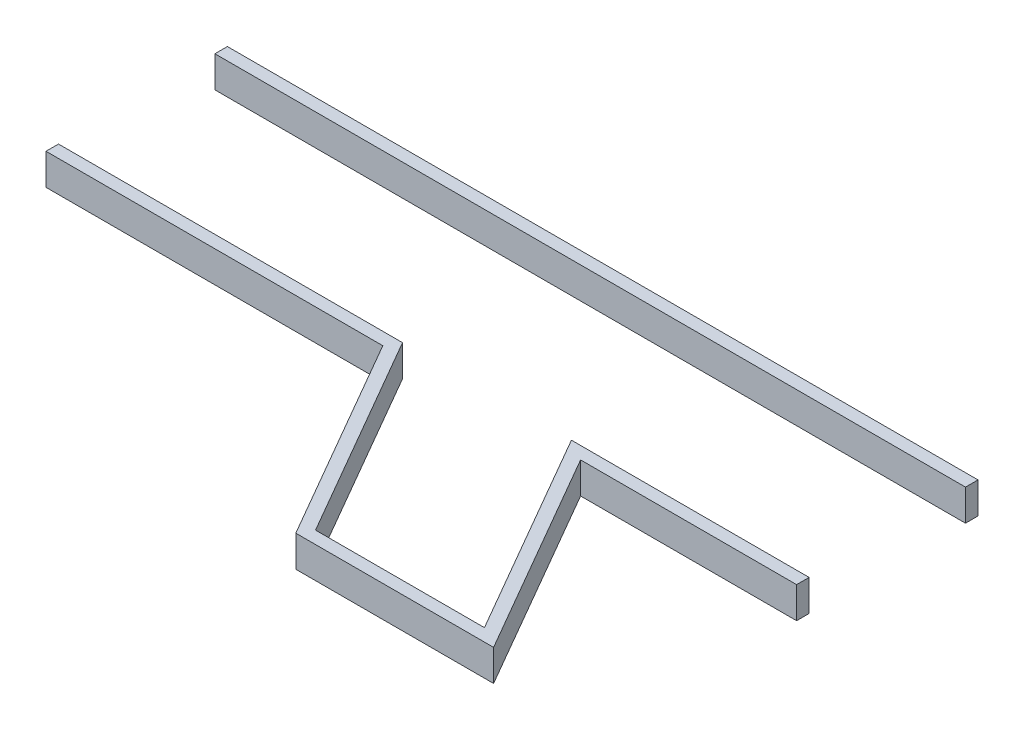
ISO-10303-21;
HEADER;
FILE_DESCRIPTION(('STEP AP214'),'2;1');
FILE_NAME('part.step','',(''),(''),'','','');
FILE_SCHEMA(('AUTOMOTIVE_DESIGN { 1 0 10303 214 1 1 1 1 }'));
ENDSEC;
DATA;
#1=APPLICATION_CONTEXT('core data for automotive mechanical design processes');
#2=APPLICATION_PROTOCOL_DEFINITION('international standard','automotive_design',2000,#1);
#3=PRODUCT_CONTEXT('',#1,'mechanical');
#4=PRODUCT('Part','Part','',(#3));
#5=PRODUCT_RELATED_PRODUCT_CATEGORY('part','',(#4));
#6=PRODUCT_DEFINITION_FORMATION('','',#4);
#7=PRODUCT_DEFINITION_CONTEXT('part definition',#1,'design');
#8=PRODUCT_DEFINITION('design','',#6,#7);
#9=PRODUCT_DEFINITION_SHAPE('','',#8);
#10=(LENGTH_UNIT() NAMED_UNIT(*) SI_UNIT(.MILLI.,.METRE.));
#11=(NAMED_UNIT(*) PLANE_ANGLE_UNIT() SI_UNIT($,.RADIAN.));
#12=(NAMED_UNIT(*) SI_UNIT($,.STERADIAN.) SOLID_ANGLE_UNIT());
#13=UNCERTAINTY_MEASURE_WITH_UNIT(LENGTH_MEASURE(1.E-05),#10,'distance_accuracy_value','');
#14=(GEOMETRIC_REPRESENTATION_CONTEXT(3) GLOBAL_UNCERTAINTY_ASSIGNED_CONTEXT((#13)) GLOBAL_UNIT_ASSIGNED_CONTEXT((#10,
#11,#12)) REPRESENTATION_CONTEXT('',''));
#15=CARTESIAN_POINT('',(0.,0.,0.));
#16=DIRECTION('',(0.,0.,1.));
#17=DIRECTION('',(1.,0.,0.));
#18=AXIS2_PLACEMENT_3D('',#15,#16,#17);
#19=CARTESIAN_POINT('',(-600.,50.,-145.));
#20=DIRECTION('',(1.,0.,0.));
#21=DIRECTION('',(0.,0.,-1.));
#22=AXIS2_PLACEMENT_3D('',#19,#20,#21);
#23=PLANE('',#22);
#24=DIRECTION('',(0.,0.,1.));
#25=VECTOR('',#24,1.);
#26=CARTESIAN_POINT('',(-600.,0.,-145.));
#27=LINE('',#26,#25);
#28=CARTESIAN_POINT('',(-600.,0.,-145.));
#29=VERTEX_POINT('',#28);
#30=CARTESIAN_POINT('',(-600.,0.,-125.));
#31=VERTEX_POINT('',#30);
#32=EDGE_CURVE('E12',#29,#31,#27,.T.);
#33=ORIENTED_EDGE('',*,*,#32,.T.);
#34=DIRECTION('',(0.,-1.,0.));
#35=VECTOR('',#34,1.);
#36=CARTESIAN_POINT('',(-600.,50.,-125.));
#37=LINE('',#36,#35);
#38=CARTESIAN_POINT('',(-600.,50.,-125.));
#39=VERTEX_POINT('',#38);
#40=EDGE_CURVE('E120',#39,#31,#37,.T.);
#41=ORIENTED_EDGE('',*,*,#40,.F.);
#42=DIRECTION('',(0.,0.,1.));
#43=VECTOR('',#42,1.);
#44=CARTESIAN_POINT('',(-600.,50.,-145.));
#45=LINE('',#44,#43);
#46=CARTESIAN_POINT('',(-600.,50.,-145.));
#47=VERTEX_POINT('',#46);
#48=EDGE_CURVE('E53',#47,#39,#45,.T.);
#49=ORIENTED_EDGE('',*,*,#48,.F.);
#50=DIRECTION('',(0.,-1.,0.));
#51=VECTOR('',#50,1.);
#52=CARTESIAN_POINT('',(-600.,50.,-145.));
#53=LINE('',#52,#51);
#54=EDGE_CURVE('E93',#47,#29,#53,.T.);
#55=ORIENTED_EDGE('',*,*,#54,.T.);
#56=EDGE_LOOP('',(#33,#41,#49,#55));
#57=FACE_BOUND('',#56,.T.);
#58=ADVANCED_FACE('F49',(#57),#23,.F.);
#59=CARTESIAN_POINT('',(-600.,50.,-125.));
#60=DIRECTION('',(0.,0.,-1.));
#61=DIRECTION('',(-1.,0.,0.));
#62=AXIS2_PLACEMENT_3D('',#59,#60,#61);
#63=PLANE('',#62);
#64=DIRECTION('',(1.,0.,0.));
#65=VECTOR('',#64,1.);
#66=CARTESIAN_POINT('',(-600.,0.,-125.));
#67=LINE('',#66,#65);
#68=CARTESIAN_POINT('',(600.,0.,-125.));
#69=VERTEX_POINT('',#68);
#70=EDGE_CURVE('E59',#31,#69,#67,.T.);
#71=ORIENTED_EDGE('',*,*,#70,.T.);
#72=DIRECTION('',(0.,-1.,0.));
#73=VECTOR('',#72,1.);
#74=CARTESIAN_POINT('',(600.,50.,-125.));
#75=LINE('',#74,#73);
#76=CARTESIAN_POINT('',(600.,50.,-125.));
#77=VERTEX_POINT('',#76);
#78=EDGE_CURVE('E107',#77,#69,#75,.T.);
#79=ORIENTED_EDGE('',*,*,#78,.F.);
#80=DIRECTION('',(1.,0.,0.));
#81=VECTOR('',#80,1.);
#82=CARTESIAN_POINT('',(-600.,50.,-125.));
#83=LINE('',#82,#81);
#84=EDGE_CURVE('E85',#39,#77,#83,.T.);
#85=ORIENTED_EDGE('',*,*,#84,.F.);
#86=ORIENTED_EDGE('',*,*,#40,.T.);
#87=EDGE_LOOP('',(#71,#79,#85,#86));
#88=FACE_BOUND('',#87,.T.);
#89=ADVANCED_FACE('F123',(#88),#63,.F.);
#90=CARTESIAN_POINT('',(600.,50.,-145.));
#91=DIRECTION('',(1.,0.,0.));
#92=DIRECTION('',(0.,0.,-1.));
#93=AXIS2_PLACEMENT_3D('',#90,#91,#92);
#94=PLANE('',#93);
#95=DIRECTION('',(0.,0.,1.));
#96=VECTOR('',#95,1.);
#97=CARTESIAN_POINT('',(600.,0.,-145.));
#98=LINE('',#97,#96);
#99=CARTESIAN_POINT('',(600.,0.,-145.));
#100=VERTEX_POINT('',#99);
#101=EDGE_CURVE('E109',#100,#69,#98,.T.);
#102=ORIENTED_EDGE('',*,*,#101,.F.);
#103=DIRECTION('',(0.,-1.,0.));
#104=VECTOR('',#103,1.);
#105=CARTESIAN_POINT('',(600.,50.,-145.));
#106=LINE('',#105,#104);
#107=CARTESIAN_POINT('',(600.,50.,-145.));
#108=VERTEX_POINT('',#107);
#109=EDGE_CURVE('E98',#108,#100,#106,.T.);
#110=ORIENTED_EDGE('',*,*,#109,.F.);
#111=DIRECTION('',(0.,0.,1.));
#112=VECTOR('',#111,1.);
#113=CARTESIAN_POINT('',(600.,50.,-145.));
#114=LINE('',#113,#112);
#115=EDGE_CURVE('E118',#108,#77,#114,.T.);
#116=ORIENTED_EDGE('',*,*,#115,.T.);
#117=ORIENTED_EDGE('',*,*,#78,.T.);
#118=EDGE_LOOP('',(#102,#110,#116,#117));
#119=FACE_BOUND('',#118,.T.);
#120=ADVANCED_FACE('F110',(#119),#94,.T.);
#121=CARTESIAN_POINT('',(-600.,50.,-145.));
#122=DIRECTION('',(0.,0.,-1.));
#123=DIRECTION('',(-1.,0.,0.));
#124=AXIS2_PLACEMENT_3D('',#121,#122,#123);
#125=PLANE('',#124);
#126=DIRECTION('',(1.,0.,0.));
#127=VECTOR('',#126,1.);
#128=CARTESIAN_POINT('',(-600.,0.,-145.));
#129=LINE('',#128,#127);
#130=EDGE_CURVE('E102',#29,#100,#129,.T.);
#131=ORIENTED_EDGE('',*,*,#130,.F.);
#132=ORIENTED_EDGE('',*,*,#54,.F.);
#133=DIRECTION('',(1.,0.,0.));
#134=VECTOR('',#133,1.);
#135=CARTESIAN_POINT('',(-600.,50.,-145.));
#136=LINE('',#135,#134);
#137=EDGE_CURVE('E104',#47,#108,#136,.T.);
#138=ORIENTED_EDGE('',*,*,#137,.T.);
#139=ORIENTED_EDGE('',*,*,#109,.T.);
#140=EDGE_LOOP('',(#131,#132,#138,#139));
#141=FACE_BOUND('',#140,.T.);
#142=ADVANCED_FACE('F100',(#141),#125,.T.);
#143=CARTESIAN_POINT('',(0.,50.,0.));
#144=DIRECTION('',(0.,1.,0.));
#145=DIRECTION('',(0.,0.,1.));
#146=AXIS2_PLACEMENT_3D('',#143,#144,#145);
#147=PLANE('',#146);
#148=ORIENTED_EDGE('',*,*,#48,.T.);
#149=ORIENTED_EDGE('',*,*,#84,.T.);
#150=ORIENTED_EDGE('',*,*,#115,.F.);
#151=ORIENTED_EDGE('',*,*,#137,.F.);
#152=EDGE_LOOP('',(#148,#149,#150,#151));
#153=FACE_BOUND('',#152,.T.);
#154=ADVANCED_FACE('F51',(#153),#147,.T.);
#155=CARTESIAN_POINT('',(0.,0.,0.));
#156=DIRECTION('',(0.,1.,0.));
#157=DIRECTION('',(0.,0.,1.));
#158=AXIS2_PLACEMENT_3D('',#155,#156,#157);
#159=PLANE('',#158);
#160=ORIENTED_EDGE('',*,*,#32,.F.);
#161=ORIENTED_EDGE('',*,*,#130,.T.);
#162=ORIENTED_EDGE('',*,*,#101,.T.);
#163=ORIENTED_EDGE('',*,*,#70,.F.);
#164=EDGE_LOOP('',(#160,#161,#162,#163));
#165=FACE_BOUND('',#164,.T.);
#166=ADVANCED_FACE('F112',(#165),#159,.F.);
#167=CLOSED_SHELL('',(#58,#89,#120,#142,#154,#166));
#168=MANIFOLD_SOLID_BREP('B2',#167);
#169=CARTESIAN_POINT('',(-91.6265877365275,50.,52.9006350946108));
#170=DIRECTION('',(0.86602540378444,0.,-0.499999999999998));
#171=DIRECTION('',(-0.499999999999998,0.,-0.86602540378444));
#172=AXIS2_PLACEMENT_3D('',#169,#170,#171);
#173=PLANE('',#172);
#174=DIRECTION('',(0.499999999999998,0.,0.86602540378444));
#175=VECTOR('',#174,1.);
#176=CARTESIAN_POINT('',(-91.6265877365275,0.,52.9006350946108));
#177=LINE('',#176,#175);
#178=CARTESIAN_POINT('',(-50.0000000000001,0.,125.));
#179=VERTEX_POINT('',#178);
#180=CARTESIAN_POINT('',(139.999999999999,0.,454.089653438087));
#181=VERTEX_POINT('',#180);
#182=EDGE_CURVE('E295',#179,#181,#177,.T.);
#183=ORIENTED_EDGE('',*,*,#182,.F.);
#184=DIRECTION('',(0.,-1.,0.));
#185=VECTOR('',#184,1.);
#186=CARTESIAN_POINT('',(-50.0000000000001,50.,125.));
#187=LINE('',#186,#185);
#188=CARTESIAN_POINT('',(-50.0000000000001,50.,125.));
#189=VERTEX_POINT('',#188);
#190=EDGE_CURVE('E47',#189,#179,#187,.T.);
#191=ORIENTED_EDGE('',*,*,#190,.F.);
#192=DIRECTION('',(0.499999999999998,0.,0.86602540378444));
#193=VECTOR('',#192,1.);
#194=CARTESIAN_POINT('',(-91.6265877365275,50.,52.9006350946108));
#195=LINE('',#194,#193);
#196=CARTESIAN_POINT('',(139.999999999999,50.,454.089653438087));
#197=VERTEX_POINT('',#196);
#198=EDGE_CURVE('E337',#189,#197,#195,.T.);
#199=ORIENTED_EDGE('',*,*,#198,.T.);
#200=DIRECTION('',(0.,-1.,0.));
#201=VECTOR('',#200,1.);
#202=CARTESIAN_POINT('',(139.999999999999,50.,454.089653438087));
#203=LINE('',#202,#201);
#204=EDGE_CURVE('E190',#197,#181,#203,.T.);
#205=ORIENTED_EDGE('',*,*,#204,.T.);
#206=EDGE_LOOP('',(#183,#191,#199,#205));
#207=FACE_BOUND('',#206,.T.);
#208=ADVANCED_FACE('F173',(#207),#173,.T.);
#209=CARTESIAN_POINT('',(0.,50.,125.));
#210=DIRECTION('',(0.,0.,1.));
#211=DIRECTION('',(1.,0.,0.));
#212=AXIS2_PLACEMENT_3D('',#209,#210,#211);
#213=PLANE('',#212);
#214=DIRECTION('',(-1.,0.,0.));
#215=VECTOR('',#214,1.);
#216=CARTESIAN_POINT('',(0.,0.,125.));
#217=LINE('',#216,#215);
#218=CARTESIAN_POINT('',(-600.,0.,125.));
#219=VERTEX_POINT('',#218);
#220=EDGE_CURVE('E298',#179,#219,#217,.T.);
#221=ORIENTED_EDGE('',*,*,#220,.T.);
#222=DIRECTION('',(0.,-1.,0.));
#223=VECTOR('',#222,1.);
#224=CARTESIAN_POINT('',(-600.,50.,125.));
#225=LINE('',#224,#223);
#226=CARTESIAN_POINT('',(-600.,50.,125.));
#227=VERTEX_POINT('',#226);
#228=EDGE_CURVE('E182',#227,#219,#225,.T.);
#229=ORIENTED_EDGE('',*,*,#228,.F.);
#230=DIRECTION('',(-1.,0.,0.));
#231=VECTOR('',#230,1.);
#232=CARTESIAN_POINT('',(0.,50.,125.));
#233=LINE('',#232,#231);
#234=EDGE_CURVE('E391',#189,#227,#233,.T.);
#235=ORIENTED_EDGE('',*,*,#234,.F.);
#236=ORIENTED_EDGE('',*,*,#190,.T.);
#237=EDGE_LOOP('',(#221,#229,#235,#236));
#238=FACE_BOUND('',#237,.T.);
#239=ADVANCED_FACE('F421',(#238),#213,.F.);
#240=CARTESIAN_POINT('',(-599.999999999999,50.,-3.33066907387549E-12));
#241=DIRECTION('',(1.,0.,0.));
#242=DIRECTION('',(0.,0.,-1.));
#243=AXIS2_PLACEMENT_3D('',#240,#241,#242);
#244=PLANE('',#243);
#245=DIRECTION('',(0.,0.,1.));
#246=VECTOR('',#245,1.);
#247=CARTESIAN_POINT('',(-599.999999999999,0.,-3.33066907387549E-12));
#248=LINE('',#247,#246);
#249=CARTESIAN_POINT('',(-600.,0.,145.));
#250=VERTEX_POINT('',#249);
#251=EDGE_CURVE('E301',#219,#250,#248,.T.);
#252=ORIENTED_EDGE('',*,*,#251,.T.);
#253=DIRECTION('',(0.,-1.,0.));
#254=VECTOR('',#253,1.);
#255=CARTESIAN_POINT('',(-600.,50.,145.));
#256=LINE('',#255,#254);
#257=CARTESIAN_POINT('',(-600.,50.,145.));
#258=VERTEX_POINT('',#257);
#259=EDGE_CURVE('E359',#258,#250,#256,.T.);
#260=ORIENTED_EDGE('',*,*,#259,.F.);
#261=DIRECTION('',(0.,0.,1.));
#262=VECTOR('',#261,1.);
#263=CARTESIAN_POINT('',(-599.999999999999,50.,-3.33066907387549E-12));
#264=LINE('',#263,#262);
#265=EDGE_CURVE('E370',#227,#258,#264,.T.);
#266=ORIENTED_EDGE('',*,*,#265,.F.);
#267=ORIENTED_EDGE('',*,*,#228,.T.);
#268=EDGE_LOOP('',(#252,#260,#266,#267));
#269=FACE_BOUND('',#268,.T.);
#270=ADVANCED_FACE('F368',(#269),#244,.F.);
#271=CARTESIAN_POINT('',(0.,50.,145.));
#272=DIRECTION('',(0.,0.,-1.));
#273=DIRECTION('',(-1.,0.,0.));
#274=AXIS2_PLACEMENT_3D('',#271,#272,#273);
#275=PLANE('',#274);
#276=DIRECTION('',(1.,0.,0.));
#277=VECTOR('',#276,1.);
#278=CARTESIAN_POINT('',(0.,0.,145.));
#279=LINE('',#278,#277);
#280=CARTESIAN_POINT('',(-61.5470053837928,0.,145.));
#281=VERTEX_POINT('',#280);
#282=EDGE_CURVE('E304',#250,#281,#279,.T.);
#283=ORIENTED_EDGE('',*,*,#282,.T.);
#284=DIRECTION('',(0.,-1.,0.));
#285=VECTOR('',#284,1.);
#286=CARTESIAN_POINT('',(-61.5470053837928,50.,145.));
#287=LINE('',#286,#285);
#288=CARTESIAN_POINT('',(-61.5470053837928,50.,145.));
#289=VERTEX_POINT('',#288);
#290=EDGE_CURVE('E356',#289,#281,#287,.T.);
#291=ORIENTED_EDGE('',*,*,#290,.F.);
#292=DIRECTION('',(1.,0.,0.));
#293=VECTOR('',#292,1.);
#294=CARTESIAN_POINT('',(0.,50.,145.));
#295=LINE('',#294,#293);
#296=EDGE_CURVE('E382',#258,#289,#295,.T.);
#297=ORIENTED_EDGE('',*,*,#296,.F.);
#298=ORIENTED_EDGE('',*,*,#259,.T.);
#299=EDGE_LOOP('',(#283,#291,#297,#298));
#300=FACE_BOUND('',#299,.T.);
#301=ADVANCED_FACE('F379',(#300),#275,.F.);
#302=CARTESIAN_POINT('',(-108.947095812216,50.,62.9006350946108));
#303=DIRECTION('',(-0.86602540378444,0.,0.499999999999998));
#304=DIRECTION('',(0.499999999999998,0.,0.86602540378444));
#305=AXIS2_PLACEMENT_3D('',#302,#303,#304);
#306=PLANE('',#305);
#307=DIRECTION('',(-0.499999999999998,0.,-0.86602540378444));
#308=VECTOR('',#307,1.);
#309=CARTESIAN_POINT('',(-108.947095812216,0.,62.9006350946108));
#310=LINE('',#309,#308);
#311=CARTESIAN_POINT('',(128.452994616207,0.,474.089653438087));
#312=VERTEX_POINT('',#311);
#313=EDGE_CURVE('E308',#312,#281,#310,.T.);
#314=ORIENTED_EDGE('',*,*,#313,.F.);
#315=DIRECTION('',(0.,-1.,0.));
#316=VECTOR('',#315,1.);
#317=CARTESIAN_POINT('',(128.452994616207,50.,474.089653438087));
#318=LINE('',#317,#316);
#319=CARTESIAN_POINT('',(128.452994616207,50.,474.089653438087));
#320=VERTEX_POINT('',#319);
#321=EDGE_CURVE('E353',#320,#312,#318,.T.);
#322=ORIENTED_EDGE('',*,*,#321,.F.);
#323=DIRECTION('',(-0.499999999999998,0.,-0.86602540378444));
#324=VECTOR('',#323,1.);
#325=CARTESIAN_POINT('',(-108.947095812216,50.,62.9006350946108));
#326=LINE('',#325,#324);
#327=EDGE_CURVE('E385',#320,#289,#326,.T.);
#328=ORIENTED_EDGE('',*,*,#327,.T.);
#329=ORIENTED_EDGE('',*,*,#290,.T.);
#330=EDGE_LOOP('',(#314,#322,#328,#329));
#331=FACE_BOUND('',#330,.T.);
#332=ADVANCED_FACE('F432',(#331),#306,.T.);
#333=CARTESIAN_POINT('',(0.,50.,474.089653438087));
#334=DIRECTION('',(0.,0.,1.));
#335=DIRECTION('',(1.,0.,0.));
#336=AXIS2_PLACEMENT_3D('',#333,#334,#335);
#337=PLANE('',#336);
#338=DIRECTION('',(-1.,0.,0.));
#339=VECTOR('',#338,1.);
#340=CARTESIAN_POINT('',(0.,0.,474.089653438087));
#341=LINE('',#340,#339);
#342=CARTESIAN_POINT('',(444.641016151377,0.,474.089653438087));
#343=VERTEX_POINT('',#342);
#344=EDGE_CURVE('E312',#343,#312,#341,.T.);
#345=ORIENTED_EDGE('',*,*,#344,.F.);
#346=DIRECTION('',(0.,-1.,0.));
#347=VECTOR('',#346,1.);
#348=CARTESIAN_POINT('',(444.641016151377,50.,474.089653438087));
#349=LINE('',#348,#347);
#350=CARTESIAN_POINT('',(444.641016151377,50.,474.089653438087));
#351=VERTEX_POINT('',#350);
#352=EDGE_CURVE('E350',#351,#343,#349,.T.);
#353=ORIENTED_EDGE('',*,*,#352,.F.);
#354=DIRECTION('',(-1.,0.,0.));
#355=VECTOR('',#354,1.);
#356=CARTESIAN_POINT('',(0.,50.,474.089653438087));
#357=LINE('',#356,#355);
#358=EDGE_CURVE('E389',#351,#320,#357,.T.);
#359=ORIENTED_EDGE('',*,*,#358,.T.);
#360=ORIENTED_EDGE('',*,*,#321,.T.);
#361=EDGE_LOOP('',(#345,#353,#359,#360));
#362=FACE_BOUND('',#361,.T.);
#363=ADVANCED_FACE('F435',(#362),#337,.T.);
#364=CARTESIAN_POINT('',(128.193920339162,50.,-74.0127944162881));
#365=DIRECTION('',(0.86602540378444,0.,-0.499999999999998));
#366=DIRECTION('',(-0.499999999999998,0.,-0.86602540378444));
#367=AXIS2_PLACEMENT_3D('',#364,#365,#366);
#368=PLANE('',#367);
#369=DIRECTION('',(0.499999999999998,0.,0.86602540378444));
#370=VECTOR('',#369,1.);
#371=CARTESIAN_POINT('',(128.193920339162,0.,-74.0127944162881));
#372=LINE('',#371,#370);
#373=CARTESIAN_POINT('',(254.641016151377,0.,145.));
#374=VERTEX_POINT('',#373);
#375=EDGE_CURVE('E316',#374,#343,#372,.T.);
#376=ORIENTED_EDGE('',*,*,#375,.F.);
#377=DIRECTION('',(0.,-1.,0.));
#378=VECTOR('',#377,1.);
#379=CARTESIAN_POINT('',(254.641016151377,50.,145.));
#380=LINE('',#379,#378);
#381=CARTESIAN_POINT('',(254.641016151377,50.,145.));
#382=VERTEX_POINT('',#381);
#383=EDGE_CURVE('E347',#382,#374,#380,.T.);
#384=ORIENTED_EDGE('',*,*,#383,.F.);
#385=DIRECTION('',(0.499999999999998,0.,0.86602540378444));
#386=VECTOR('',#385,1.);
#387=CARTESIAN_POINT('',(128.193920339162,50.,-74.0127944162881));
#388=LINE('',#387,#386);
#389=EDGE_CURVE('E398',#382,#351,#388,.T.);
#390=ORIENTED_EDGE('',*,*,#389,.T.);
#391=ORIENTED_EDGE('',*,*,#352,.T.);
#392=EDGE_LOOP('',(#376,#384,#390,#391));
#393=FACE_BOUND('',#392,.T.);
#394=ADVANCED_FACE('F439',(#393),#368,.T.);
#395=CARTESIAN_POINT('',(0.,50.,145.));
#396=DIRECTION('',(0.,0.,-1.));
#397=DIRECTION('',(-1.,0.,0.));
#398=AXIS2_PLACEMENT_3D('',#395,#396,#397);
#399=PLANE('',#398);
#400=DIRECTION('',(1.,0.,0.));
#401=VECTOR('',#400,1.);
#402=CARTESIAN_POINT('',(0.,0.,145.));
#403=LINE('',#402,#401);
#404=CARTESIAN_POINT('',(600.,0.,145.));
#405=VERTEX_POINT('',#404);
#406=EDGE_CURVE('E320',#374,#405,#403,.T.);
#407=ORIENTED_EDGE('',*,*,#406,.T.);
#408=DIRECTION('',(0.,-1.,0.));
#409=VECTOR('',#408,1.);
#410=CARTESIAN_POINT('',(600.,50.,145.));
#411=LINE('',#410,#409);
#412=CARTESIAN_POINT('',(600.,50.,145.));
#413=VERTEX_POINT('',#412);
#414=EDGE_CURVE('E344',#413,#405,#411,.T.);
#415=ORIENTED_EDGE('',*,*,#414,.F.);
#416=DIRECTION('',(1.,0.,0.));
#417=VECTOR('',#416,1.);
#418=CARTESIAN_POINT('',(0.,50.,145.));
#419=LINE('',#418,#417);
#420=EDGE_CURVE('E402',#382,#413,#419,.T.);
#421=ORIENTED_EDGE('',*,*,#420,.F.);
#422=ORIENTED_EDGE('',*,*,#383,.T.);
#423=EDGE_LOOP('',(#407,#415,#421,#422));
#424=FACE_BOUND('',#423,.T.);
#425=ADVANCED_FACE('F443',(#424),#399,.F.);
#426=CARTESIAN_POINT('',(599.999999999999,50.,-3.33066907387547E-12));
#427=DIRECTION('',(1.,0.,0.));
#428=DIRECTION('',(0.,0.,-1.));
#429=AXIS2_PLACEMENT_3D('',#426,#427,#428);
#430=PLANE('',#429);
#431=DIRECTION('',(0.,0.,1.));
#432=VECTOR('',#431,1.);
#433=CARTESIAN_POINT('',(599.999999999999,0.,-3.33066907387547E-12));
#434=LINE('',#433,#432);
#435=CARTESIAN_POINT('',(600.,0.,125.));
#436=VERTEX_POINT('',#435);
#437=EDGE_CURVE('E324',#436,#405,#434,.T.);
#438=ORIENTED_EDGE('',*,*,#437,.F.);
#439=DIRECTION('',(0.,-1.,0.));
#440=VECTOR('',#439,1.);
#441=CARTESIAN_POINT('',(600.,50.,125.));
#442=LINE('',#441,#440);
#443=CARTESIAN_POINT('',(600.,50.,125.));
#444=VERTEX_POINT('',#443);
#445=EDGE_CURVE('E285',#444,#436,#442,.T.);
#446=ORIENTED_EDGE('',*,*,#445,.F.);
#447=DIRECTION('',(0.,0.,1.));
#448=VECTOR('',#447,1.);
#449=CARTESIAN_POINT('',(599.999999999999,50.,-3.33066907387547E-12));
#450=LINE('',#449,#448);
#451=EDGE_CURVE('E273',#444,#413,#450,.T.);
#452=ORIENTED_EDGE('',*,*,#451,.T.);
#453=ORIENTED_EDGE('',*,*,#414,.T.);
#454=EDGE_LOOP('',(#438,#446,#452,#453));
#455=FACE_BOUND('',#454,.T.);
#456=ADVANCED_FACE('F407',(#455),#430,.T.);
#457=CARTESIAN_POINT('',(0.,50.,125.));
#458=DIRECTION('',(0.,0.,1.));
#459=DIRECTION('',(1.,0.,0.));
#460=AXIS2_PLACEMENT_3D('',#457,#458,#459);
#461=PLANE('',#460);
#462=DIRECTION('',(-1.,0.,0.));
#463=VECTOR('',#462,1.);
#464=CARTESIAN_POINT('',(0.,0.,125.));
#465=LINE('',#464,#463);
#466=CARTESIAN_POINT('',(220.,0.,125.));
#467=VERTEX_POINT('',#466);
#468=EDGE_CURVE('E281',#436,#467,#465,.T.);
#469=ORIENTED_EDGE('',*,*,#468,.T.);
#470=DIRECTION('',(0.,-1.,0.));
#471=VECTOR('',#470,1.);
#472=CARTESIAN_POINT('',(220.,50.,125.));
#473=LINE('',#472,#471);
#474=CARTESIAN_POINT('',(220.,50.,125.));
#475=VERTEX_POINT('',#474);
#476=EDGE_CURVE('E278',#475,#467,#473,.T.);
#477=ORIENTED_EDGE('',*,*,#476,.F.);
#478=DIRECTION('',(-1.,0.,0.));
#479=VECTOR('',#478,1.);
#480=CARTESIAN_POINT('',(0.,50.,125.));
#481=LINE('',#480,#479);
#482=EDGE_CURVE('E265',#444,#475,#481,.T.);
#483=ORIENTED_EDGE('',*,*,#482,.F.);
#484=ORIENTED_EDGE('',*,*,#445,.T.);
#485=EDGE_LOOP('',(#469,#477,#483,#484));
#486=FACE_BOUND('',#485,.T.);
#487=ADVANCED_FACE('F279',(#486),#461,.F.);
#488=CARTESIAN_POINT('',(110.873412263473,50.,-64.0127944162882));
#489=DIRECTION('',(-0.86602540378444,0.,0.499999999999998));
#490=DIRECTION('',(0.499999999999998,0.,0.86602540378444));
#491=AXIS2_PLACEMENT_3D('',#488,#489,#490);
#492=PLANE('',#491);
#493=DIRECTION('',(-0.499999999999998,0.,-0.86602540378444));
#494=VECTOR('',#493,1.);
#495=CARTESIAN_POINT('',(110.873412263473,0.,-64.0127944162882));
#496=LINE('',#495,#494);
#497=CARTESIAN_POINT('',(409.999999999999,0.,454.089653438087));
#498=VERTEX_POINT('',#497);
#499=EDGE_CURVE('E330',#498,#467,#496,.T.);
#500=ORIENTED_EDGE('',*,*,#499,.F.);
#501=DIRECTION('',(0.,-1.,0.));
#502=VECTOR('',#501,1.);
#503=CARTESIAN_POINT('',(409.999999999999,50.,454.089653438087));
#504=LINE('',#503,#502);
#505=CARTESIAN_POINT('',(409.999999999999,50.,454.089653438087));
#506=VERTEX_POINT('',#505);
#507=EDGE_CURVE('E227',#506,#498,#504,.T.);
#508=ORIENTED_EDGE('',*,*,#507,.F.);
#509=DIRECTION('',(-0.499999999999998,0.,-0.86602540378444));
#510=VECTOR('',#509,1.);
#511=CARTESIAN_POINT('',(110.873412263473,50.,-64.0127944162882));
#512=LINE('',#511,#510);
#513=EDGE_CURVE('E271',#506,#475,#512,.T.);
#514=ORIENTED_EDGE('',*,*,#513,.T.);
#515=ORIENTED_EDGE('',*,*,#476,.T.);
#516=EDGE_LOOP('',(#500,#508,#514,#515));
#517=FACE_BOUND('',#516,.T.);
#518=ADVANCED_FACE('F287',(#517),#492,.T.);
#519=CARTESIAN_POINT('',(0.,50.,454.089653438087));
#520=DIRECTION('',(0.,0.,-1.));
#521=DIRECTION('',(-1.,0.,0.));
#522=AXIS2_PLACEMENT_3D('',#519,#520,#521);
#523=PLANE('',#522);
#524=DIRECTION('',(1.,0.,0.));
#525=VECTOR('',#524,1.);
#526=CARTESIAN_POINT('',(0.,0.,454.089653438087));
#527=LINE('',#526,#525);
#528=EDGE_CURVE('E333',#181,#498,#527,.T.);
#529=ORIENTED_EDGE('',*,*,#528,.F.);
#530=ORIENTED_EDGE('',*,*,#204,.F.);
#531=DIRECTION('',(1.,0.,0.));
#532=VECTOR('',#531,1.);
#533=CARTESIAN_POINT('',(0.,50.,454.089653438087));
#534=LINE('',#533,#532);
#535=EDGE_CURVE('E289',#197,#506,#534,.T.);
#536=ORIENTED_EDGE('',*,*,#535,.T.);
#537=ORIENTED_EDGE('',*,*,#507,.T.);
#538=EDGE_LOOP('',(#529,#530,#536,#537));
#539=FACE_BOUND('',#538,.T.);
#540=ADVANCED_FACE('F410',(#539),#523,.T.);
#541=CARTESIAN_POINT('',(0.,50.,0.));
#542=DIRECTION('',(0.,1.,0.));
#543=DIRECTION('',(0.,0.,1.));
#544=AXIS2_PLACEMENT_3D('',#541,#542,#543);
#545=PLANE('',#544);
#546=ORIENTED_EDGE('',*,*,#198,.F.);
#547=ORIENTED_EDGE('',*,*,#234,.T.);
#548=ORIENTED_EDGE('',*,*,#265,.T.);
#549=ORIENTED_EDGE('',*,*,#296,.T.);
#550=ORIENTED_EDGE('',*,*,#327,.F.);
#551=ORIENTED_EDGE('',*,*,#358,.F.);
#552=ORIENTED_EDGE('',*,*,#389,.F.);
#553=ORIENTED_EDGE('',*,*,#420,.T.);
#554=ORIENTED_EDGE('',*,*,#451,.F.);
#555=ORIENTED_EDGE('',*,*,#482,.T.);
#556=ORIENTED_EDGE('',*,*,#513,.F.);
#557=ORIENTED_EDGE('',*,*,#535,.F.);
#558=EDGE_LOOP('',(#546,#547,#548,#549,#550,#551,#552,#553,#554,#555,#556,#557));
#559=FACE_BOUND('',#558,.T.);
#560=ADVANCED_FACE('F268',(#559),#545,.T.);
#561=CARTESIAN_POINT('',(0.,0.,0.));
#562=DIRECTION('',(0.,1.,0.));
#563=DIRECTION('',(0.,0.,1.));
#564=AXIS2_PLACEMENT_3D('',#561,#562,#563);
#565=PLANE('',#564);
#566=ORIENTED_EDGE('',*,*,#182,.T.);
#567=ORIENTED_EDGE('',*,*,#528,.T.);
#568=ORIENTED_EDGE('',*,*,#499,.T.);
#569=ORIENTED_EDGE('',*,*,#468,.F.);
#570=ORIENTED_EDGE('',*,*,#437,.T.);
#571=ORIENTED_EDGE('',*,*,#406,.F.);
#572=ORIENTED_EDGE('',*,*,#375,.T.);
#573=ORIENTED_EDGE('',*,*,#344,.T.);
#574=ORIENTED_EDGE('',*,*,#313,.T.);
#575=ORIENTED_EDGE('',*,*,#282,.F.);
#576=ORIENTED_EDGE('',*,*,#251,.F.);
#577=ORIENTED_EDGE('',*,*,#220,.F.);
#578=EDGE_LOOP('',(#566,#567,#568,#569,#570,#571,#572,#573,#574,#575,#576,#577));
#579=FACE_BOUND('',#578,.T.);
#580=ADVANCED_FACE('F375',(#579),#565,.F.);
#581=CLOSED_SHELL('',(#208,#239,#270,#301,#332,#363,#394,#425,#456,#487,#518,#540,#560,#580));
#582=MANIFOLD_SOLID_BREP('B6',#581);
#583=ADVANCED_BREP_SHAPE_REPRESENTATION('',(#18,#168,#582),#14);
#584=SHAPE_DEFINITION_REPRESENTATION(#9,#583);
ENDSEC;
END-ISO-10303-21;
